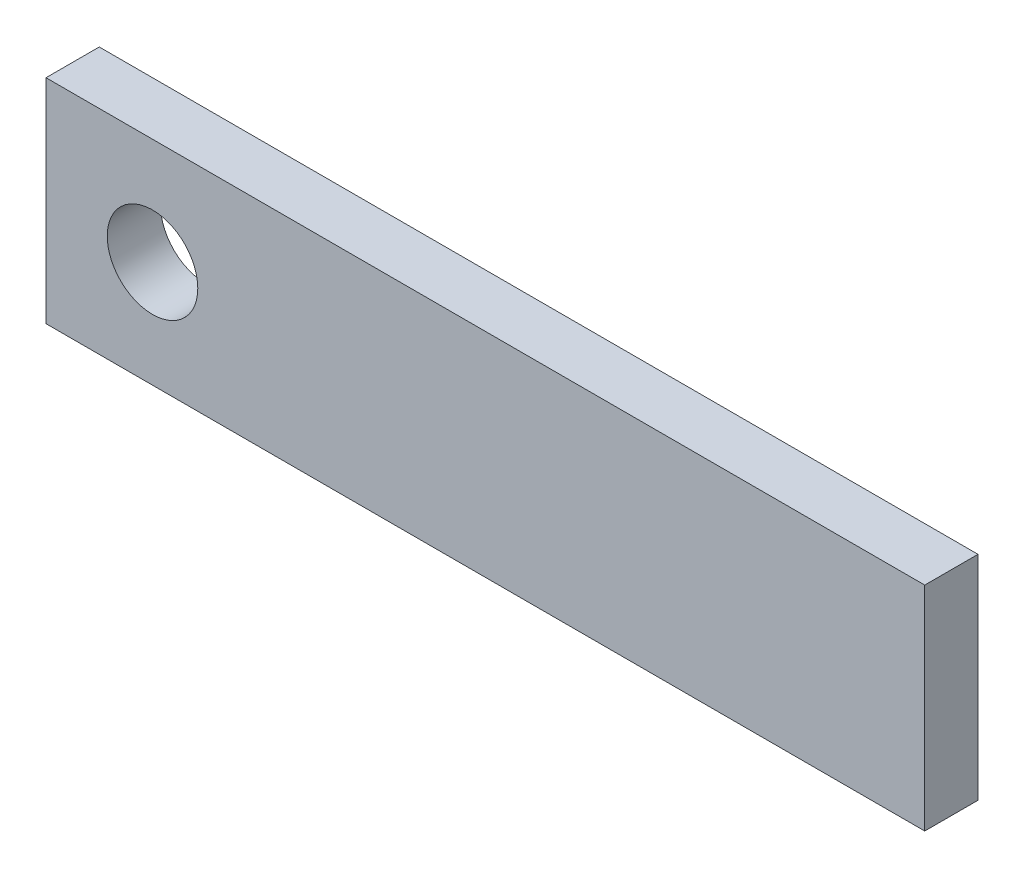
ISO-10303-21;
HEADER;
FILE_DESCRIPTION(('STEP AP214'),'2;1');
FILE_NAME('part.step','',(''),(''),'','','');
FILE_SCHEMA(('AUTOMOTIVE_DESIGN { 1 0 10303 214 1 1 1 1 }'));
ENDSEC;
DATA;
#1=APPLICATION_CONTEXT('core data for automotive mechanical design processes');
#2=APPLICATION_PROTOCOL_DEFINITION('international standard','automotive_design',2000,#1);
#3=PRODUCT_CONTEXT('',#1,'mechanical');
#4=PRODUCT('Part','Part','',(#3));
#5=PRODUCT_RELATED_PRODUCT_CATEGORY('part','',(#4));
#6=PRODUCT_DEFINITION_FORMATION('','',#4);
#7=PRODUCT_DEFINITION_CONTEXT('part definition',#1,'design');
#8=PRODUCT_DEFINITION('design','',#6,#7);
#9=PRODUCT_DEFINITION_SHAPE('','',#8);
#10=(LENGTH_UNIT() NAMED_UNIT(*) SI_UNIT(.MILLI.,.METRE.));
#11=(NAMED_UNIT(*) PLANE_ANGLE_UNIT() SI_UNIT($,.RADIAN.));
#12=(NAMED_UNIT(*) SI_UNIT($,.STERADIAN.) SOLID_ANGLE_UNIT());
#13=UNCERTAINTY_MEASURE_WITH_UNIT(LENGTH_MEASURE(1.E-05),#10,'distance_accuracy_value','');
#14=(GEOMETRIC_REPRESENTATION_CONTEXT(3) GLOBAL_UNCERTAINTY_ASSIGNED_CONTEXT((#13)) GLOBAL_UNIT_ASSIGNED_CONTEXT((#10,
#11,#12)) REPRESENTATION_CONTEXT('',''));
#15=CARTESIAN_POINT('',(0.,0.,0.));
#16=DIRECTION('',(0.,0.,1.));
#17=DIRECTION('',(1.,0.,0.));
#18=AXIS2_PLACEMENT_3D('',#15,#16,#17);
#19=CARTESIAN_POINT('',(-42.,-171.5,252.4));
#20=DIRECTION('',(0.,0.,1.));
#21=DIRECTION('',(1.,0.,0.));
#22=AXIS2_PLACEMENT_3D('',#19,#20,#21);
#23=CYLINDRICAL_SURFACE('',#22,1.7);
#24=DIRECTION('',(0.,0.,1.));
#25=VECTOR('',#24,1.);
#26=CARTESIAN_POINT('',(-40.3,-171.5,252.4));
#27=LINE('',#26,#25);
#28=CARTESIAN_POINT('',(-40.3,-171.5,252.5));
#29=VERTEX_POINT('',#28);
#30=CARTESIAN_POINT('',(-40.3,-171.5,254.5));
#31=VERTEX_POINT('',#30);
#32=EDGE_CURVE('E9',#29,#31,#27,.T.);
#33=ORIENTED_EDGE('',*,*,#32,.F.);
#34=CARTESIAN_POINT('',(-42.,-171.5,252.5));
#35=DIRECTION('',(0.,0.,1.));
#36=DIRECTION('',(1.,0.,0.));
#37=AXIS2_PLACEMENT_3D('',#34,#35,#36);
#38=CIRCLE('',#37,1.7);
#39=EDGE_CURVE('E25',#29,#29,#38,.T.);
#40=ORIENTED_EDGE('',*,*,#39,.F.);
#41=ORIENTED_EDGE('',*,*,#32,.T.);
#42=CARTESIAN_POINT('',(-42.,-171.5,254.5));
#43=DIRECTION('',(0.,0.,1.));
#44=DIRECTION('',(1.,0.,0.));
#45=AXIS2_PLACEMENT_3D('',#42,#43,#44);
#46=CIRCLE('',#45,1.7);
#47=EDGE_CURVE('E70',#31,#31,#46,.T.);
#48=ORIENTED_EDGE('',*,*,#47,.T.);
#49=EDGE_LOOP('',(#33,#40,#41,#48));
#50=FACE_BOUND('',#49,.T.);
#51=ADVANCED_FACE('F14',(#50),#23,.F.);
#52=CARTESIAN_POINT('',(-13.,-175.5,252.5));
#53=DIRECTION('',(1.,0.,0.));
#54=DIRECTION('',(0.,1.,0.));
#55=AXIS2_PLACEMENT_3D('',#52,#53,#54);
#56=PLANE('',#55);
#57=DIRECTION('',(0.,0.,1.));
#58=VECTOR('',#57,1.);
#59=CARTESIAN_POINT('',(-13.,-175.5,252.5));
#60=LINE('',#59,#58);
#61=CARTESIAN_POINT('',(-13.,-175.5,252.5));
#62=VERTEX_POINT('',#61);
#63=CARTESIAN_POINT('',(-13.,-175.5,254.5));
#64=VERTEX_POINT('',#63);
#65=EDGE_CURVE('E129',#62,#64,#60,.T.);
#66=ORIENTED_EDGE('',*,*,#65,.F.);
#67=DIRECTION('',(0.,1.,0.));
#68=VECTOR('',#67,1.);
#69=CARTESIAN_POINT('',(-13.,-175.5,252.5));
#70=LINE('',#69,#68);
#71=CARTESIAN_POINT('',(-13.,-167.5,252.5));
#72=VERTEX_POINT('',#71);
#73=EDGE_CURVE('E73',#62,#72,#70,.T.);
#74=ORIENTED_EDGE('',*,*,#73,.T.);
#75=DIRECTION('',(0.,0.,1.));
#76=VECTOR('',#75,1.);
#77=CARTESIAN_POINT('',(-13.,-167.5,252.5));
#78=LINE('',#77,#76);
#79=CARTESIAN_POINT('',(-13.,-167.5,254.5));
#80=VERTEX_POINT('',#79);
#81=EDGE_CURVE('E79',#72,#80,#78,.T.);
#82=ORIENTED_EDGE('',*,*,#81,.T.);
#83=DIRECTION('',(0.,1.,0.));
#84=VECTOR('',#83,1.);
#85=CARTESIAN_POINT('',(-13.,-175.5,254.5));
#86=LINE('',#85,#84);
#87=EDGE_CURVE('E111',#64,#80,#86,.T.);
#88=ORIENTED_EDGE('',*,*,#87,.F.);
#89=EDGE_LOOP('',(#66,#74,#82,#88));
#90=FACE_BOUND('',#89,.T.);
#91=ADVANCED_FACE('F126',(#90),#56,.T.);
#92=CARTESIAN_POINT('',(-46.,-175.5,252.5));
#93=DIRECTION('',(0.,0.,1.));
#94=DIRECTION('',(1.,0.,0.));
#95=AXIS2_PLACEMENT_3D('',#92,#93,#94);
#96=PLANE('',#95);
#97=ORIENTED_EDGE('',*,*,#39,.T.);
#98=EDGE_LOOP('',(#97));
#99=FACE_BOUND('',#98,.T.);
#100=DIRECTION('',(1.,0.,0.));
#101=VECTOR('',#100,1.);
#102=CARTESIAN_POINT('',(-46.,-167.5,252.5));
#103=LINE('',#102,#101);
#104=CARTESIAN_POINT('',(-46.,-167.5,252.5));
#105=VERTEX_POINT('',#104);
#106=EDGE_CURVE('E85',#105,#72,#103,.T.);
#107=ORIENTED_EDGE('',*,*,#106,.T.);
#108=ORIENTED_EDGE('',*,*,#73,.F.);
#109=DIRECTION('',(1.,0.,0.));
#110=VECTOR('',#109,1.);
#111=CARTESIAN_POINT('',(-46.,-175.5,252.5));
#112=LINE('',#111,#110);
#113=CARTESIAN_POINT('',(-46.,-175.5,252.5));
#114=VERTEX_POINT('',#113);
#115=EDGE_CURVE('E18',#114,#62,#112,.T.);
#116=ORIENTED_EDGE('',*,*,#115,.F.);
#117=DIRECTION('',(0.,1.,0.));
#118=VECTOR('',#117,1.);
#119=CARTESIAN_POINT('',(-46.,-175.5,252.5));
#120=LINE('',#119,#118);
#121=EDGE_CURVE('E89',#114,#105,#120,.T.);
#122=ORIENTED_EDGE('',*,*,#121,.T.);
#123=EDGE_LOOP('',(#107,#108,#116,#122));
#124=FACE_BOUND('',#123,.T.);
#125=ADVANCED_FACE('F117',(#99,#124),#96,.F.);
#126=CARTESIAN_POINT('',(-46.,-167.5,252.5));
#127=DIRECTION('',(0.,1.,0.));
#128=DIRECTION('',(1.,0.,0.));
#129=AXIS2_PLACEMENT_3D('',#126,#127,#128);
#130=PLANE('',#129);
#131=ORIENTED_EDGE('',*,*,#106,.F.);
#132=DIRECTION('',(0.,0.,1.));
#133=VECTOR('',#132,1.);
#134=CARTESIAN_POINT('',(-46.,-167.5,252.5));
#135=LINE('',#134,#133);
#136=CARTESIAN_POINT('',(-46.,-167.5,254.5));
#137=VERTEX_POINT('',#136);
#138=EDGE_CURVE('E86',#105,#137,#135,.T.);
#139=ORIENTED_EDGE('',*,*,#138,.T.);
#140=DIRECTION('',(1.,0.,0.));
#141=VECTOR('',#140,1.);
#142=CARTESIAN_POINT('',(-46.,-167.5,254.5));
#143=LINE('',#142,#141);
#144=EDGE_CURVE('E83',#137,#80,#143,.T.);
#145=ORIENTED_EDGE('',*,*,#144,.T.);
#146=ORIENTED_EDGE('',*,*,#81,.F.);
#147=EDGE_LOOP('',(#131,#139,#145,#146));
#148=FACE_BOUND('',#147,.T.);
#149=ADVANCED_FACE('F121',(#148),#130,.T.);
#150=CARTESIAN_POINT('',(-46.,-175.5,254.5));
#151=DIRECTION('',(0.,0.,1.));
#152=DIRECTION('',(1.,0.,0.));
#153=AXIS2_PLACEMENT_3D('',#150,#151,#152);
#154=PLANE('',#153);
#155=ORIENTED_EDGE('',*,*,#47,.F.);
#156=EDGE_LOOP('',(#155));
#157=FACE_BOUND('',#156,.T.);
#158=DIRECTION('',(0.,1.,0.));
#159=VECTOR('',#158,1.);
#160=CARTESIAN_POINT('',(-46.,-175.5,254.5));
#161=LINE('',#160,#159);
#162=CARTESIAN_POINT('',(-46.,-175.5,254.5));
#163=VERTEX_POINT('',#162);
#164=EDGE_CURVE('E90',#163,#137,#161,.T.);
#165=ORIENTED_EDGE('',*,*,#164,.F.);
#166=DIRECTION('',(1.,0.,0.));
#167=VECTOR('',#166,1.);
#168=CARTESIAN_POINT('',(-46.,-175.5,254.5));
#169=LINE('',#168,#167);
#170=EDGE_CURVE('E132',#163,#64,#169,.T.);
#171=ORIENTED_EDGE('',*,*,#170,.T.);
#172=ORIENTED_EDGE('',*,*,#87,.T.);
#173=ORIENTED_EDGE('',*,*,#144,.F.);
#174=EDGE_LOOP('',(#165,#171,#172,#173));
#175=FACE_BOUND('',#174,.T.);
#176=ADVANCED_FACE('F16',(#157,#175),#154,.T.);
#177=CARTESIAN_POINT('',(-46.,-175.5,252.5));
#178=DIRECTION('',(0.,1.,0.));
#179=DIRECTION('',(1.,0.,0.));
#180=AXIS2_PLACEMENT_3D('',#177,#178,#179);
#181=PLANE('',#180);
#182=ORIENTED_EDGE('',*,*,#65,.T.);
#183=ORIENTED_EDGE('',*,*,#170,.F.);
#184=DIRECTION('',(0.,0.,1.));
#185=VECTOR('',#184,1.);
#186=CARTESIAN_POINT('',(-46.,-175.5,252.5));
#187=LINE('',#186,#185);
#188=EDGE_CURVE('E99',#114,#163,#187,.T.);
#189=ORIENTED_EDGE('',*,*,#188,.F.);
#190=ORIENTED_EDGE('',*,*,#115,.T.);
#191=EDGE_LOOP('',(#182,#183,#189,#190));
#192=FACE_BOUND('',#191,.T.);
#193=ADVANCED_FACE('F146',(#192),#181,.F.);
#194=CARTESIAN_POINT('',(-46.,-175.5,252.5));
#195=DIRECTION('',(1.,0.,0.));
#196=DIRECTION('',(0.,1.,0.));
#197=AXIS2_PLACEMENT_3D('',#194,#195,#196);
#198=PLANE('',#197);
#199=ORIENTED_EDGE('',*,*,#164,.T.);
#200=ORIENTED_EDGE('',*,*,#138,.F.);
#201=ORIENTED_EDGE('',*,*,#121,.F.);
#202=ORIENTED_EDGE('',*,*,#188,.T.);
#203=EDGE_LOOP('',(#199,#200,#201,#202));
#204=FACE_BOUND('',#203,.T.);
#205=ADVANCED_FACE('F140',(#204),#198,.F.);
#206=CLOSED_SHELL('',(#51,#91,#125,#149,#176,#193,#205));
#207=MANIFOLD_SOLID_BREP('B1',#206);
#208=ADVANCED_BREP_SHAPE_REPRESENTATION('',(#18,#207),#14);
#209=SHAPE_DEFINITION_REPRESENTATION(#9,#208);
ENDSEC;
END-ISO-10303-21;
